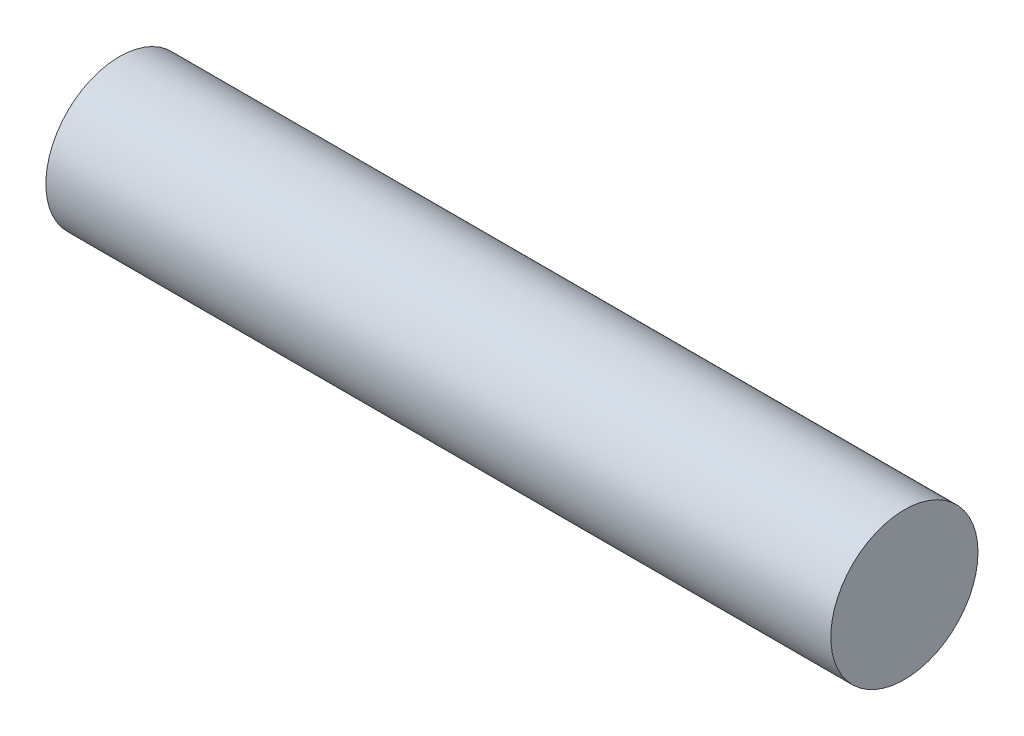
ISO-10303-21;
HEADER;
FILE_DESCRIPTION(('STEP AP214'),'2;1');
FILE_NAME('part.step','',(''),(''),'','','');
FILE_SCHEMA(('AUTOMOTIVE_DESIGN { 1 0 10303 214 1 1 1 1 }'));
ENDSEC;
DATA;
#1=APPLICATION_CONTEXT('core data for automotive mechanical design processes');
#2=APPLICATION_PROTOCOL_DEFINITION('international standard','automotive_design',2000,#1);
#3=PRODUCT_CONTEXT('',#1,'mechanical');
#4=PRODUCT('Part','Part','',(#3));
#5=PRODUCT_RELATED_PRODUCT_CATEGORY('part','',(#4));
#6=PRODUCT_DEFINITION_FORMATION('','',#4);
#7=PRODUCT_DEFINITION_CONTEXT('part definition',#1,'design');
#8=PRODUCT_DEFINITION('design','',#6,#7);
#9=PRODUCT_DEFINITION_SHAPE('','',#8);
#10=(LENGTH_UNIT() NAMED_UNIT(*) SI_UNIT(.MILLI.,.METRE.));
#11=(NAMED_UNIT(*) PLANE_ANGLE_UNIT() SI_UNIT($,.RADIAN.));
#12=(NAMED_UNIT(*) SI_UNIT($,.STERADIAN.) SOLID_ANGLE_UNIT());
#13=UNCERTAINTY_MEASURE_WITH_UNIT(LENGTH_MEASURE(1.E-05),#10,'distance_accuracy_value','');
#14=(GEOMETRIC_REPRESENTATION_CONTEXT(3) GLOBAL_UNCERTAINTY_ASSIGNED_CONTEXT((#13)) GLOBAL_UNIT_ASSIGNED_CONTEXT((#10,
#11,#12)) REPRESENTATION_CONTEXT('',''));
#15=CARTESIAN_POINT('',(0.,0.,0.));
#16=DIRECTION('',(0.,0.,1.));
#17=DIRECTION('',(1.,0.,0.));
#18=AXIS2_PLACEMENT_3D('',#15,#16,#17);
#19=CARTESIAN_POINT('',(19.25,0.,-7.93749999999997));
#20=DIRECTION('',(-1.,0.,0.));
#21=DIRECTION('',(0.,0.,1.));
#22=AXIS2_PLACEMENT_3D('',#19,#20,#21);
#23=PLANE('',#22);
#24=CARTESIAN_POINT('',(19.25,0.,0.));
#25=DIRECTION('',(1.,0.,0.));
#26=DIRECTION('',(0.,0.,-1.));
#27=AXIS2_PLACEMENT_3D('',#24,#25,#26);
#28=CIRCLE('',#27,9.52499999999999);
#29=CARTESIAN_POINT('',(19.25,0.,-9.52499999999997));
#30=VERTEX_POINT('',#29);
#31=EDGE_CURVE('E10',#30,#30,#28,.T.);
#32=ORIENTED_EDGE('',*,*,#31,.F.);
#33=EDGE_LOOP('',(#32));
#34=FACE_BOUND('',#33,.T.);
#35=ADVANCED_FACE('F38',(#34),#23,.T.);
#36=CARTESIAN_POINT('',(157.324000000006,0.,0.));
#37=DIRECTION('',(1.,0.,0.));
#38=DIRECTION('',(0.,0.,-1.));
#39=AXIS2_PLACEMENT_3D('',#36,#37,#38);
#40=CYLINDRICAL_SURFACE('',#39,9.52499999999994);
#41=ORIENTED_EDGE('',*,*,#31,.T.);
#42=EDGE_LOOP('',(#41));
#43=FACE_BOUND('',#42,.T.);
#44=CARTESIAN_POINT('',(120.85,0.,0.));
#45=DIRECTION('',(1.,0.,0.));
#46=DIRECTION('',(0.,0.,-1.));
#47=AXIS2_PLACEMENT_3D('',#44,#45,#46);
#48=CIRCLE('',#47,9.52499999999994);
#49=CARTESIAN_POINT('',(120.85,0.,-9.52499999999994));
#50=VERTEX_POINT('',#49);
#51=EDGE_CURVE('E42',#50,#50,#48,.F.);
#52=ORIENTED_EDGE('',*,*,#51,.T.);
#53=EDGE_LOOP('',(#52));
#54=FACE_BOUND('',#53,.T.);
#55=ADVANCED_FACE('F40',(#43,#54),#40,.T.);
#56=CARTESIAN_POINT('',(120.85,0.,0.));
#57=DIRECTION('',(-1.,0.,0.));
#58=DIRECTION('',(0.,0.,1.));
#59=AXIS2_PLACEMENT_3D('',#56,#57,#58);
#60=PLANE('',#59);
#61=ORIENTED_EDGE('',*,*,#51,.F.);
#62=EDGE_LOOP('',(#61));
#63=FACE_BOUND('',#62,.T.);
#64=ADVANCED_FACE('F52',(#63),#60,.F.);
#65=CLOSED_SHELL('',(#35,#55,#64));
#66=MANIFOLD_SOLID_BREP('B2',#65);
#67=ADVANCED_BREP_SHAPE_REPRESENTATION('',(#18,#66),#14);
#68=SHAPE_DEFINITION_REPRESENTATION(#9,#67);
ENDSEC;
END-ISO-10303-21;
